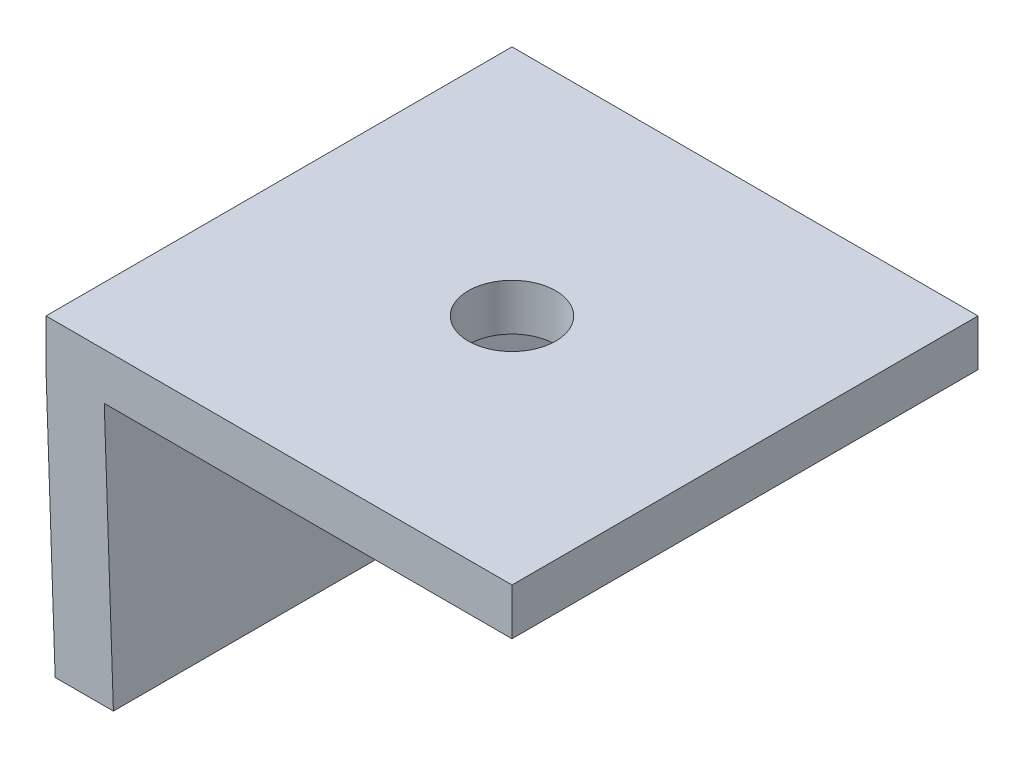
ISO-10303-21;
HEADER;
FILE_DESCRIPTION(('STEP AP214'),'2;1');
FILE_NAME('part.step','',(''),(''),'','','');
FILE_SCHEMA(('AUTOMOTIVE_DESIGN { 1 0 10303 214 1 1 1 1 }'));
ENDSEC;
DATA;
#1=APPLICATION_CONTEXT('core data for automotive mechanical design processes');
#2=APPLICATION_PROTOCOL_DEFINITION('international standard','automotive_design',2000,#1);
#3=PRODUCT_CONTEXT('',#1,'mechanical');
#4=PRODUCT('Part','Part','',(#3));
#5=PRODUCT_RELATED_PRODUCT_CATEGORY('part','',(#4));
#6=PRODUCT_DEFINITION_FORMATION('','',#4);
#7=PRODUCT_DEFINITION_CONTEXT('part definition',#1,'design');
#8=PRODUCT_DEFINITION('design','',#6,#7);
#9=PRODUCT_DEFINITION_SHAPE('','',#8);
#10=(LENGTH_UNIT() NAMED_UNIT(*) SI_UNIT(.MILLI.,.METRE.));
#11=(NAMED_UNIT(*) PLANE_ANGLE_UNIT() SI_UNIT($,.RADIAN.));
#12=(NAMED_UNIT(*) SI_UNIT($,.STERADIAN.) SOLID_ANGLE_UNIT());
#13=UNCERTAINTY_MEASURE_WITH_UNIT(LENGTH_MEASURE(1.E-05),#10,'distance_accuracy_value','');
#14=(GEOMETRIC_REPRESENTATION_CONTEXT(3) GLOBAL_UNCERTAINTY_ASSIGNED_CONTEXT((#13)) GLOBAL_UNIT_ASSIGNED_CONTEXT((#10,
#11,#12)) REPRESENTATION_CONTEXT('',''));
#15=CARTESIAN_POINT('',(0.,0.,0.));
#16=DIRECTION('',(0.,0.,1.));
#17=DIRECTION('',(1.,0.,0.));
#18=AXIS2_PLACEMENT_3D('',#15,#16,#17);
#19=CARTESIAN_POINT('',(0.,0.,25.4));
#20=DIRECTION('',(0.999390827019096,0.0348994967024972,0.));
#21=DIRECTION('',(-0.0348994967024972,0.999390827019096,0.));
#22=AXIS2_PLACEMENT_3D('',#19,#20,#21);
#23=PLANE('',#22);
#24=CARTESIAN_POINT('',(0.250270046511646,-7.16679644103533,12.7));
#25=DIRECTION('',(0.999390827019096,0.0348994967024972,0.));
#26=DIRECTION('',(0.0348994967024972,-0.999390827019096,0.));
#27=AXIS2_PLACEMENT_3D('',#24,#25,#26);
#28=ELLIPSE('',#27,3.17693530314876,3.175);
#29=CARTESIAN_POINT('',(0.361143489647933,-10.3417964410353,12.7));
#30=VERTEX_POINT('',#29);
#31=EDGE_CURVE('E168',#30,#30,#28,.T.);
#32=ORIENTED_EDGE('',*,*,#31,.T.);
#33=EDGE_LOOP('',(#32));
#34=FACE_BOUND('',#33,.T.);
#35=DIRECTION('',(0.0348994967024972,-0.999390827019096,0.));
#36=VECTOR('',#35,1.);
#37=CARTESIAN_POINT('',(0.,0.,0.));
#38=LINE('',#37,#36);
#39=CARTESIAN_POINT('',(0.,0.,0.));
#40=VERTEX_POINT('',#39);
#41=CARTESIAN_POINT('',(0.498626559136928,-14.2787964410353,0.));
#42=VERTEX_POINT('',#41);
#43=EDGE_CURVE('E120',#40,#42,#38,.T.);
#44=ORIENTED_EDGE('',*,*,#43,.T.);
#45=DIRECTION('',(0.,0.,-1.));
#46=VECTOR('',#45,1.);
#47=CARTESIAN_POINT('',(0.498626559136928,-14.2787964410353,25.4));
#48=LINE('',#47,#46);
#49=CARTESIAN_POINT('',(0.498626559136928,-14.2787964410353,25.4));
#50=VERTEX_POINT('',#49);
#51=EDGE_CURVE('E11',#50,#42,#48,.T.);
#52=ORIENTED_EDGE('',*,*,#51,.F.);
#53=DIRECTION('',(0.0348994967024972,-0.999390827019096,0.));
#54=VECTOR('',#53,1.);
#55=CARTESIAN_POINT('',(0.,0.,25.4));
#56=LINE('',#55,#54);
#57=CARTESIAN_POINT('',(0.,0.,25.4));
#58=VERTEX_POINT('',#57);
#59=EDGE_CURVE('E50',#58,#50,#56,.T.);
#60=ORIENTED_EDGE('',*,*,#59,.F.);
#61=DIRECTION('',(0.,0.,-1.));
#62=VECTOR('',#61,1.);
#63=CARTESIAN_POINT('',(0.,0.,25.4));
#64=LINE('',#63,#62);
#65=EDGE_CURVE('E69',#58,#40,#64,.T.);
#66=ORIENTED_EDGE('',*,*,#65,.T.);
#67=EDGE_LOOP('',(#44,#52,#60,#66));
#68=FACE_BOUND('',#67,.T.);
#69=ADVANCED_FACE('F33',(#34,#68),#23,.F.);
#70=CARTESIAN_POINT('',(0.498626559136928,-14.2787964410353,25.4));
#71=DIRECTION('',(0.,1.,0.));
#72=DIRECTION('',(0.,0.,1.));
#73=AXIS2_PLACEMENT_3D('',#70,#71,#72);
#74=PLANE('',#73);
#75=DIRECTION('',(1.,0.,0.));
#76=VECTOR('',#75,1.);
#77=CARTESIAN_POINT('',(0.498626559136928,-14.2787964410353,0.));
#78=LINE('',#77,#76);
#79=CARTESIAN_POINT('',(3.67362655913693,-14.2787964410353,0.));
#80=VERTEX_POINT('',#79);
#81=EDGE_CURVE('E64',#42,#80,#78,.T.);
#82=ORIENTED_EDGE('',*,*,#81,.T.);
#83=DIRECTION('',(0.,0.,-1.));
#84=VECTOR('',#83,1.);
#85=CARTESIAN_POINT('',(3.67362655913693,-14.2787964410353,25.4));
#86=LINE('',#85,#84);
#87=CARTESIAN_POINT('',(3.67362655913693,-14.2787964410353,25.4));
#88=VERTEX_POINT('',#87);
#89=EDGE_CURVE('E42',#88,#80,#86,.T.);
#90=ORIENTED_EDGE('',*,*,#89,.F.);
#91=DIRECTION('',(1.,0.,0.));
#92=VECTOR('',#91,1.);
#93=CARTESIAN_POINT('',(0.498626559136928,-14.2787964410353,25.4));
#94=LINE('',#93,#92);
#95=EDGE_CURVE('E74',#50,#88,#94,.T.);
#96=ORIENTED_EDGE('',*,*,#95,.F.);
#97=ORIENTED_EDGE('',*,*,#51,.T.);
#98=EDGE_LOOP('',(#82,#90,#96,#97));
#99=FACE_BOUND('',#98,.T.);
#100=ADVANCED_FACE('F189',(#99),#74,.F.);
#101=CARTESIAN_POINT('',(3.175,0.,25.4));
#102=DIRECTION('',(-0.999390827019096,-0.0348994967024972,0.));
#103=DIRECTION('',(0.0348994967024972,-0.999390827019096,0.));
#104=AXIS2_PLACEMENT_3D('',#101,#102,#103);
#105=PLANE('',#104);
#106=CARTESIAN_POINT('',(3.42527004651165,-7.16679644103533,12.7));
#107=DIRECTION('',(-0.999390827019096,-0.0348994967024972,0.));
#108=DIRECTION('',(0.0348994967024972,-0.999390827019096,0.));
#109=AXIS2_PLACEMENT_3D('',#106,#107,#108);
#110=ELLIPSE('',#109,3.17693530314876,3.175);
#111=CARTESIAN_POINT('',(3.53614348964793,-10.3417964410353,12.7));
#112=VERTEX_POINT('',#111);
#113=EDGE_CURVE('E36',#112,#112,#110,.T.);
#114=ORIENTED_EDGE('',*,*,#113,.T.);
#115=EDGE_LOOP('',(#114));
#116=FACE_BOUND('',#115,.T.);
#117=DIRECTION('',(-0.0348994967024972,0.999390827019096,0.));
#118=VECTOR('',#117,1.);
#119=CARTESIAN_POINT('',(3.175,0.,0.));
#120=LINE('',#119,#118);
#121=CARTESIAN_POINT('',(3.175,0.,0.));
#122=VERTEX_POINT('',#121);
#123=EDGE_CURVE('E128',#80,#122,#120,.T.);
#124=ORIENTED_EDGE('',*,*,#123,.T.);
#125=DIRECTION('',(0.,0.,-1.));
#126=VECTOR('',#125,1.);
#127=CARTESIAN_POINT('',(3.175,0.,25.4));
#128=LINE('',#127,#126);
#129=CARTESIAN_POINT('',(3.175,0.,25.4));
#130=VERTEX_POINT('',#129);
#131=EDGE_CURVE('E135',#130,#122,#128,.T.);
#132=ORIENTED_EDGE('',*,*,#131,.F.);
#133=DIRECTION('',(-0.0348994967024972,0.999390827019096,0.));
#134=VECTOR('',#133,1.);
#135=CARTESIAN_POINT('',(3.175,0.,25.4));
#136=LINE('',#135,#134);
#137=EDGE_CURVE('E130',#88,#130,#136,.T.);
#138=ORIENTED_EDGE('',*,*,#137,.F.);
#139=ORIENTED_EDGE('',*,*,#89,.T.);
#140=EDGE_LOOP('',(#124,#132,#138,#139));
#141=FACE_BOUND('',#140,.T.);
#142=ADVANCED_FACE('F141',(#116,#141),#105,.F.);
#143=CARTESIAN_POINT('',(0.,0.,25.4));
#144=DIRECTION('',(0.,0.,1.));
#145=DIRECTION('',(1.,0.,0.));
#146=AXIS2_PLACEMENT_3D('',#143,#144,#145);
#147=PLANE('',#146);
#148=ORIENTED_EDGE('',*,*,#59,.T.);
#149=ORIENTED_EDGE('',*,*,#95,.T.);
#150=ORIENTED_EDGE('',*,*,#137,.T.);
#151=DIRECTION('',(1.,0.,0.));
#152=VECTOR('',#151,1.);
#153=CARTESIAN_POINT('',(0.,0.,25.4));
#154=LINE('',#153,#152);
#155=CARTESIAN_POINT('',(25.4,0.,25.4));
#156=VERTEX_POINT('',#155);
#157=EDGE_CURVE('E153',#130,#156,#154,.T.);
#158=ORIENTED_EDGE('',*,*,#157,.T.);
#159=DIRECTION('',(0.,-1.,0.));
#160=VECTOR('',#159,1.);
#161=CARTESIAN_POINT('',(25.4,2.54,25.4));
#162=LINE('',#161,#160);
#163=CARTESIAN_POINT('',(25.4,2.54,25.4));
#164=VERTEX_POINT('',#163);
#165=EDGE_CURVE('E103',#164,#156,#162,.T.);
#166=ORIENTED_EDGE('',*,*,#165,.F.);
#167=DIRECTION('',(1.,0.,0.));
#168=VECTOR('',#167,1.);
#169=CARTESIAN_POINT('',(0.,2.54,25.4));
#170=LINE('',#169,#168);
#171=CARTESIAN_POINT('',(0.,2.54,25.4));
#172=VERTEX_POINT('',#171);
#173=EDGE_CURVE('E97',#172,#164,#170,.T.);
#174=ORIENTED_EDGE('',*,*,#173,.F.);
#175=DIRECTION('',(0.,-1.,0.));
#176=VECTOR('',#175,1.);
#177=CARTESIAN_POINT('',(0.,2.54,25.4));
#178=LINE('',#177,#176);
#179=EDGE_CURVE('E101',#172,#58,#178,.T.);
#180=ORIENTED_EDGE('',*,*,#179,.T.);
#181=EDGE_LOOP('',(#148,#149,#150,#158,#166,#174,#180));
#182=FACE_BOUND('',#181,.T.);
#183=ADVANCED_FACE('F99',(#182),#147,.T.);
#184=CARTESIAN_POINT('',(0.,0.,0.));
#185=DIRECTION('',(0.,0.,1.));
#186=DIRECTION('',(1.,0.,0.));
#187=AXIS2_PLACEMENT_3D('',#184,#185,#186);
#188=PLANE('',#187);
#189=ORIENTED_EDGE('',*,*,#43,.F.);
#190=DIRECTION('',(0.,-1.,0.));
#191=VECTOR('',#190,1.);
#192=CARTESIAN_POINT('',(0.,2.54,0.));
#193=LINE('',#192,#191);
#194=CARTESIAN_POINT('',(0.,2.54,0.));
#195=VERTEX_POINT('',#194);
#196=EDGE_CURVE('E157',#195,#40,#193,.T.);
#197=ORIENTED_EDGE('',*,*,#196,.F.);
#198=DIRECTION('',(-1.,0.,0.));
#199=VECTOR('',#198,1.);
#200=CARTESIAN_POINT('',(0.,2.54,0.));
#201=LINE('',#200,#199);
#202=CARTESIAN_POINT('',(25.4,2.54,0.));
#203=VERTEX_POINT('',#202);
#204=EDGE_CURVE('E113',#203,#195,#201,.T.);
#205=ORIENTED_EDGE('',*,*,#204,.F.);
#206=DIRECTION('',(0.,-1.,0.));
#207=VECTOR('',#206,1.);
#208=CARTESIAN_POINT('',(25.4,2.54,0.));
#209=LINE('',#208,#207);
#210=CARTESIAN_POINT('',(25.4,0.,0.));
#211=VERTEX_POINT('',#210);
#212=EDGE_CURVE('E123',#203,#211,#209,.T.);
#213=ORIENTED_EDGE('',*,*,#212,.T.);
#214=DIRECTION('',(-1.,0.,0.));
#215=VECTOR('',#214,1.);
#216=CARTESIAN_POINT('',(0.,0.,0.));
#217=LINE('',#216,#215);
#218=EDGE_CURVE('E117',#211,#122,#217,.T.);
#219=ORIENTED_EDGE('',*,*,#218,.T.);
#220=ORIENTED_EDGE('',*,*,#123,.F.);
#221=ORIENTED_EDGE('',*,*,#81,.F.);
#222=EDGE_LOOP('',(#189,#197,#205,#213,#219,#220,#221));
#223=FACE_BOUND('',#222,.T.);
#224=ADVANCED_FACE('F145',(#223),#188,.F.);
#225=CARTESIAN_POINT('',(0.,0.,0.));
#226=DIRECTION('',(0.,1.,0.));
#227=DIRECTION('',(0.,0.,1.));
#228=AXIS2_PLACEMENT_3D('',#225,#226,#227);
#229=PLANE('',#228);
#230=CARTESIAN_POINT('',(12.7,0.,12.7));
#231=DIRECTION('',(0.,1.,0.));
#232=DIRECTION('',(0.,0.,1.));
#233=AXIS2_PLACEMENT_3D('',#230,#231,#232);
#234=CIRCLE('',#233,2.38125);
#235=CARTESIAN_POINT('',(12.7,0.,15.08125));
#236=VERTEX_POINT('',#235);
#237=EDGE_CURVE('E163',#236,#236,#234,.T.);
#238=ORIENTED_EDGE('',*,*,#237,.T.);
#239=EDGE_LOOP('',(#238));
#240=FACE_BOUND('',#239,.T.);
#241=ORIENTED_EDGE('',*,*,#157,.F.);
#242=ORIENTED_EDGE('',*,*,#131,.T.);
#243=ORIENTED_EDGE('',*,*,#218,.F.);
#244=DIRECTION('',(0.,0.,-1.));
#245=VECTOR('',#244,1.);
#246=CARTESIAN_POINT('',(25.4,0.,0.));
#247=LINE('',#246,#245);
#248=EDGE_CURVE('E151',#156,#211,#247,.T.);
#249=ORIENTED_EDGE('',*,*,#248,.F.);
#250=EDGE_LOOP('',(#241,#242,#243,#249));
#251=FACE_BOUND('',#250,.T.);
#252=ADVANCED_FACE('F200',(#240,#251),#229,.F.);
#253=CARTESIAN_POINT('',(0.,2.54,0.));
#254=DIRECTION('',(0.,1.,0.));
#255=DIRECTION('',(0.,0.,1.));
#256=AXIS2_PLACEMENT_3D('',#253,#254,#255);
#257=PLANE('',#256);
#258=DIRECTION('',(0.,0.,1.));
#259=VECTOR('',#258,1.);
#260=CARTESIAN_POINT('',(0.,2.54,0.));
#261=LINE('',#260,#259);
#262=EDGE_CURVE('E107',#195,#172,#261,.T.);
#263=ORIENTED_EDGE('',*,*,#262,.T.);
#264=ORIENTED_EDGE('',*,*,#173,.T.);
#265=DIRECTION('',(0.,0.,-1.));
#266=VECTOR('',#265,1.);
#267=CARTESIAN_POINT('',(25.4,2.54,0.));
#268=LINE('',#267,#266);
#269=EDGE_CURVE('E106',#164,#203,#268,.T.);
#270=ORIENTED_EDGE('',*,*,#269,.T.);
#271=ORIENTED_EDGE('',*,*,#204,.T.);
#272=EDGE_LOOP('',(#263,#264,#270,#271));
#273=FACE_BOUND('',#272,.T.);
#274=CARTESIAN_POINT('',(12.7,2.54,12.7));
#275=DIRECTION('',(0.,1.,0.));
#276=DIRECTION('',(0.,0.,1.));
#277=AXIS2_PLACEMENT_3D('',#274,#275,#276);
#278=CIRCLE('',#277,2.38125);
#279=CARTESIAN_POINT('',(12.7,2.54,15.08125));
#280=VERTEX_POINT('',#279);
#281=EDGE_CURVE('E160',#280,#280,#278,.T.);
#282=ORIENTED_EDGE('',*,*,#281,.F.);
#283=EDGE_LOOP('',(#282));
#284=FACE_BOUND('',#283,.T.);
#285=ADVANCED_FACE('F110',(#273,#284),#257,.T.);
#286=CARTESIAN_POINT('',(0.,2.54,0.));
#287=DIRECTION('',(1.,0.,0.));
#288=DIRECTION('',(0.,0.,-1.));
#289=AXIS2_PLACEMENT_3D('',#286,#287,#288);
#290=PLANE('',#289);
#291=ORIENTED_EDGE('',*,*,#65,.F.);
#292=ORIENTED_EDGE('',*,*,#179,.F.);
#293=ORIENTED_EDGE('',*,*,#262,.F.);
#294=ORIENTED_EDGE('',*,*,#196,.T.);
#295=EDGE_LOOP('',(#291,#292,#293,#294));
#296=FACE_BOUND('',#295,.T.);
#297=ADVANCED_FACE('F119',(#296),#290,.F.);
#298=CARTESIAN_POINT('',(25.4,2.54,0.));
#299=DIRECTION('',(-1.,0.,0.));
#300=DIRECTION('',(0.,0.,1.));
#301=AXIS2_PLACEMENT_3D('',#298,#299,#300);
#302=PLANE('',#301);
#303=ORIENTED_EDGE('',*,*,#248,.T.);
#304=ORIENTED_EDGE('',*,*,#212,.F.);
#305=ORIENTED_EDGE('',*,*,#269,.F.);
#306=ORIENTED_EDGE('',*,*,#165,.T.);
#307=EDGE_LOOP('',(#303,#304,#305,#306));
#308=FACE_BOUND('',#307,.T.);
#309=ADVANCED_FACE('F186',(#308),#302,.F.);
#310=CARTESIAN_POINT('',(12.7,2.54,12.7));
#311=DIRECTION('',(0.,-1.,0.));
#312=DIRECTION('',(0.,0.,-1.));
#313=AXIS2_PLACEMENT_3D('',#310,#311,#312);
#314=CYLINDRICAL_SURFACE('',#313,2.38125);
#315=ORIENTED_EDGE('',*,*,#281,.T.);
#316=EDGE_LOOP('',(#315));
#317=FACE_BOUND('',#316,.T.);
#318=ORIENTED_EDGE('',*,*,#237,.F.);
#319=EDGE_LOOP('',(#318));
#320=FACE_BOUND('',#319,.T.);
#321=ADVANCED_FACE('F181',(#317,#320),#314,.F.);
#322=CARTESIAN_POINT('',(-15.748,-7.16679644103533,12.7));
#323=DIRECTION('',(1.,0.,0.));
#324=DIRECTION('',(0.,0.,-1.));
#325=AXIS2_PLACEMENT_3D('',#322,#323,#324);
#326=CYLINDRICAL_SURFACE('',#325,3.175);
#327=ORIENTED_EDGE('',*,*,#113,.F.);
#328=EDGE_LOOP('',(#327));
#329=FACE_BOUND('',#328,.T.);
#330=ORIENTED_EDGE('',*,*,#31,.F.);
#331=EDGE_LOOP('',(#330));
#332=FACE_BOUND('',#331,.T.);
#333=ADVANCED_FACE('F178',(#329,#332),#326,.F.);
#334=CLOSED_SHELL('',(#69,#100,#142,#183,#224,#252,#285,#297,#309,#321,#333));
#335=MANIFOLD_SOLID_BREP('B2',#334);
#336=ADVANCED_BREP_SHAPE_REPRESENTATION('',(#18,#335),#14);
#337=SHAPE_DEFINITION_REPRESENTATION(#9,#336);
ENDSEC;
END-ISO-10303-21;
